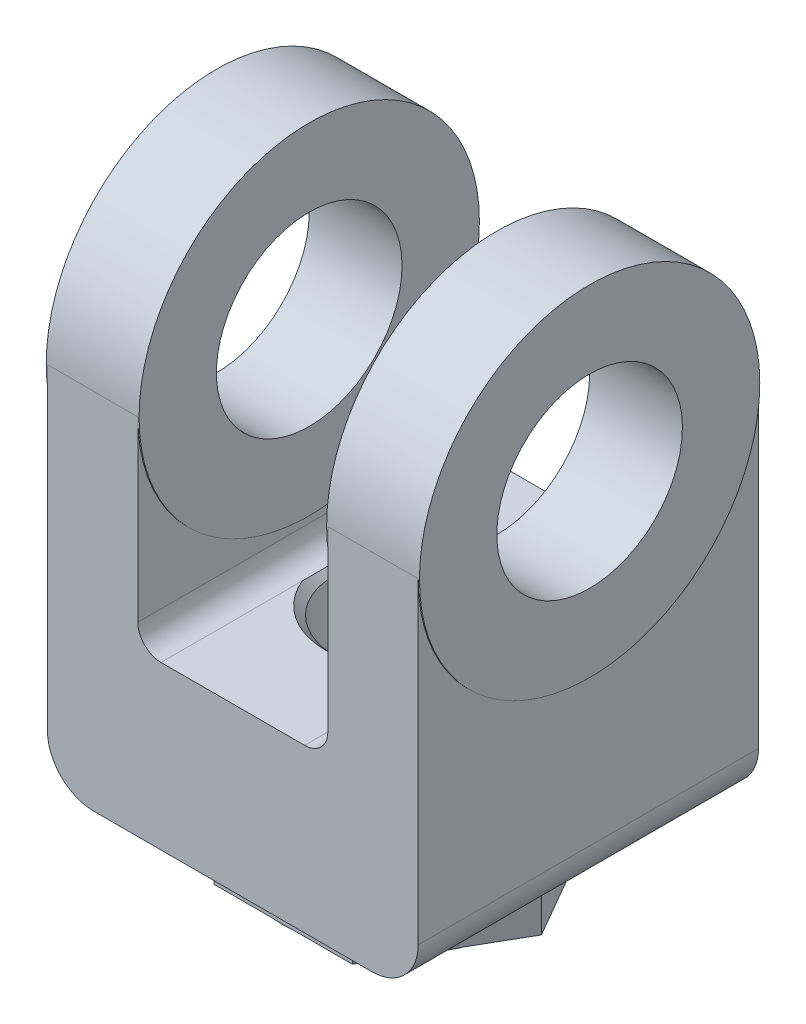
ISO-10303-21;
HEADER;
FILE_DESCRIPTION(('STEP AP214'),'2;1');
FILE_NAME('part.step','',(''),(''),'','','');
FILE_SCHEMA(('AUTOMOTIVE_DESIGN { 1 0 10303 214 1 1 1 1 }'));
ENDSEC;
DATA;
#1=APPLICATION_CONTEXT('core data for automotive mechanical design processes');
#2=APPLICATION_PROTOCOL_DEFINITION('international standard','automotive_design',2000,#1);
#3=PRODUCT_CONTEXT('',#1,'mechanical');
#4=PRODUCT('Part','Part','',(#3));
#5=PRODUCT_RELATED_PRODUCT_CATEGORY('part','',(#4));
#6=PRODUCT_DEFINITION_FORMATION('','',#4);
#7=PRODUCT_DEFINITION_CONTEXT('part definition',#1,'design');
#8=PRODUCT_DEFINITION('design','',#6,#7);
#9=PRODUCT_DEFINITION_SHAPE('','',#8);
#10=(LENGTH_UNIT() NAMED_UNIT(*) SI_UNIT(.MILLI.,.METRE.));
#11=(NAMED_UNIT(*) PLANE_ANGLE_UNIT() SI_UNIT($,.RADIAN.));
#12=(NAMED_UNIT(*) SI_UNIT($,.STERADIAN.) SOLID_ANGLE_UNIT());
#13=UNCERTAINTY_MEASURE_WITH_UNIT(LENGTH_MEASURE(1.E-05),#10,'distance_accuracy_value','');
#14=(GEOMETRIC_REPRESENTATION_CONTEXT(3) GLOBAL_UNCERTAINTY_ASSIGNED_CONTEXT((#13)) GLOBAL_UNIT_ASSIGNED_CONTEXT((#10,
#11,#12)) REPRESENTATION_CONTEXT('',''));
#15=CARTESIAN_POINT('',(0.,0.,0.));
#16=DIRECTION('',(0.,0.,1.));
#17=DIRECTION('',(1.,0.,0.));
#18=AXIS2_PLACEMENT_3D('',#15,#16,#17);
#19=CARTESIAN_POINT('',(28.412850122494,22.225,49.2125));
#20=DIRECTION('',(-0.866025403784435,0.,-0.500000000000007));
#21=DIRECTION('',(-0.500000000000007,0.,0.866025403784435));
#22=AXIS2_PLACEMENT_3D('',#19,#20,#21);
#23=PLANE('',#22);
#24=DIRECTION('',(-0.500000000000014,0.,0.86602540378443));
#25=VECTOR('',#24,1.);
#26=CARTESIAN_POINT('',(42.6192751837415,0.254,24.6062500000003));
#27=LINE('',#26,#25);
#28=CARTESIAN_POINT('',(42.6192751837415,0.254,24.6062500000003));
#29=VERTEX_POINT('',#28);
#30=CARTESIAN_POINT('',(28.4128501224939,0.254,49.2125));
#31=VERTEX_POINT('',#30);
#32=EDGE_CURVE('E262',#29,#31,#27,.T.);
#33=ORIENTED_EDGE('',*,*,#32,.F.);
#34=DIRECTION('',(-0.500000000000001,0.,0.866025403784438));
#35=VECTOR('',#34,1.);
#36=CARTESIAN_POINT('',(56.8257002449889,0.254,0.));
#37=LINE('',#36,#35);
#38=CARTESIAN_POINT('',(56.8257002449889,0.254,0.));
#39=VERTEX_POINT('',#38);
#40=EDGE_CURVE('E254',#39,#29,#37,.T.);
#41=ORIENTED_EDGE('',*,*,#40,.F.);
#42=DIRECTION('',(0.,-1.,0.));
#43=VECTOR('',#42,1.);
#44=CARTESIAN_POINT('',(56.825700244989,22.225,0.));
#45=LINE('',#44,#43);
#46=CARTESIAN_POINT('',(56.8257002449889,22.225,0.));
#47=VERTEX_POINT('',#46);
#48=EDGE_CURVE('E335',#47,#39,#45,.T.);
#49=ORIENTED_EDGE('',*,*,#48,.F.);
#50=DIRECTION('',(0.500000000000007,0.,-0.866025403784434));
#51=VECTOR('',#50,1.);
#52=CARTESIAN_POINT('',(28.412850122494,22.225,49.2125));
#53=LINE('',#52,#51);
#54=CARTESIAN_POINT('',(28.412850122494,22.225,49.2125));
#55=VERTEX_POINT('',#54);
#56=EDGE_CURVE('E326',#55,#47,#53,.T.);
#57=ORIENTED_EDGE('',*,*,#56,.F.);
#58=DIRECTION('',(0.,-1.,0.));
#59=VECTOR('',#58,1.);
#60=CARTESIAN_POINT('',(28.412850122494,22.225,49.2125));
#61=LINE('',#60,#59);
#62=EDGE_CURVE('E2836',#55,#31,#61,.T.);
#63=ORIENTED_EDGE('',*,*,#62,.T.);
#64=EDGE_LOOP('',(#33,#41,#49,#57,#63));
#65=FACE_BOUND('',#64,.T.);
#66=ADVANCED_FACE('F53',(#65),#23,.F.);
#67=CARTESIAN_POINT('',(-28.412850122494,22.225,49.2125));
#68=DIRECTION('',(0.,0.,-1.));
#69=DIRECTION('',(-1.,0.,0.));
#70=AXIS2_PLACEMENT_3D('',#67,#68,#69);
#71=PLANE('',#70);
#72=DIRECTION('',(-1.,0.,0.));
#73=VECTOR('',#72,1.);
#74=CARTESIAN_POINT('',(0.,0.254,49.2125));
#75=LINE('',#74,#73);
#76=CARTESIAN_POINT('',(0.,0.254,49.2125));
#77=VERTEX_POINT('',#76);
#78=CARTESIAN_POINT('',(-28.412850122494,0.254,49.2125));
#79=VERTEX_POINT('',#78);
#80=EDGE_CURVE('E266',#77,#79,#75,.T.);
#81=ORIENTED_EDGE('',*,*,#80,.F.);
#82=DIRECTION('',(-1.,0.,0.));
#83=VECTOR('',#82,1.);
#84=CARTESIAN_POINT('',(28.4128501224939,0.254,49.2125));
#85=LINE('',#84,#83);
#86=EDGE_CURVE('E267',#31,#77,#85,.T.);
#87=ORIENTED_EDGE('',*,*,#86,.F.);
#88=ORIENTED_EDGE('',*,*,#62,.F.);
#89=DIRECTION('',(1.,0.,0.));
#90=VECTOR('',#89,1.);
#91=CARTESIAN_POINT('',(-28.4128501224939,22.225,49.2125));
#92=LINE('',#91,#90);
#93=CARTESIAN_POINT('',(-28.4128501224939,22.225,49.2125));
#94=VERTEX_POINT('',#93);
#95=EDGE_CURVE('E323',#94,#55,#92,.T.);
#96=ORIENTED_EDGE('',*,*,#95,.F.);
#97=DIRECTION('',(0.,-1.,0.));
#98=VECTOR('',#97,1.);
#99=CARTESIAN_POINT('',(-28.4128501224939,22.225,49.2125));
#100=LINE('',#99,#98);
#101=EDGE_CURVE('E2838',#94,#79,#100,.T.);
#102=ORIENTED_EDGE('',*,*,#101,.T.);
#103=EDGE_LOOP('',(#81,#87,#88,#96,#102));
#104=FACE_BOUND('',#103,.T.);
#105=ADVANCED_FACE('F997',(#104),#71,.F.);
#106=CARTESIAN_POINT('',(-56.8257002449889,22.225,0.));
#107=DIRECTION('',(0.866025403784435,0.,-0.500000000000007));
#108=DIRECTION('',(-0.500000000000007,0.,-0.866025403784435));
#109=AXIS2_PLACEMENT_3D('',#106,#107,#108);
#110=PLANE('',#109);
#111=DIRECTION('',(-0.500000000000007,0.,-0.866025403784434));
#112=VECTOR('',#111,1.);
#113=CARTESIAN_POINT('',(-42.6192751837414,0.254,24.6062500000002));
#114=LINE('',#113,#112);
#115=CARTESIAN_POINT('',(-42.6192751837414,0.254,24.6062500000002));
#116=VERTEX_POINT('',#115);
#117=CARTESIAN_POINT('',(-56.825700244989,0.254,0.));
#118=VERTEX_POINT('',#117);
#119=EDGE_CURVE('E271',#116,#118,#114,.T.);
#120=ORIENTED_EDGE('',*,*,#119,.F.);
#121=DIRECTION('',(-0.500000000000013,0.,-0.866025403784431));
#122=VECTOR('',#121,1.);
#123=CARTESIAN_POINT('',(-28.412850122494,0.254,49.2125));
#124=LINE('',#123,#122);
#125=EDGE_CURVE('E272',#79,#116,#124,.T.);
#126=ORIENTED_EDGE('',*,*,#125,.F.);
#127=ORIENTED_EDGE('',*,*,#101,.F.);
#128=DIRECTION('',(0.500000000000007,0.,0.866025403784434));
#129=VECTOR('',#128,1.);
#130=CARTESIAN_POINT('',(-56.8257002449889,22.225,0.));
#131=LINE('',#130,#129);
#132=CARTESIAN_POINT('',(-56.8257002449889,22.225,0.));
#133=VERTEX_POINT('',#132);
#134=EDGE_CURVE('E320',#133,#94,#131,.T.);
#135=ORIENTED_EDGE('',*,*,#134,.F.);
#136=DIRECTION('',(0.,-1.,0.));
#137=VECTOR('',#136,1.);
#138=CARTESIAN_POINT('',(-56.8257002449889,22.225,0.));
#139=LINE('',#138,#137);
#140=EDGE_CURVE('E329',#133,#118,#139,.T.);
#141=ORIENTED_EDGE('',*,*,#140,.T.);
#142=EDGE_LOOP('',(#120,#126,#127,#135,#141));
#143=FACE_BOUND('',#142,.T.);
#144=ADVANCED_FACE('F1007',(#143),#110,.F.);
#145=CARTESIAN_POINT('',(39.0017,171.45,69.85));
#146=DIRECTION('',(1.,0.,0.));
#147=DIRECTION('',(0.,0.,-1.));
#148=AXIS2_PLACEMENT_3D('',#145,#146,#147);
#149=PLANE('',#148);
#150=CARTESIAN_POINT('',(39.0017,171.45,0.));
#151=DIRECTION('',(1.,0.,0.));
#152=DIRECTION('',(0.,0.,-1.));
#153=AXIS2_PLACEMENT_3D('',#150,#151,#152);
#154=CIRCLE('',#153,69.85);
#155=CARTESIAN_POINT('',(39.0017,171.45,-69.85));
#156=VERTEX_POINT('',#155);
#157=CARTESIAN_POINT('',(39.0017,171.45,69.85));
#158=VERTEX_POINT('',#157);
#159=EDGE_CURVE('E237',#156,#158,#154,.F.);
#160=ORIENTED_EDGE('',*,*,#159,.F.);
#161=DIRECTION('',(0.,-1.,0.));
#162=VECTOR('',#161,1.);
#163=CARTESIAN_POINT('',(39.0017,171.45,-69.85));
#164=LINE('',#163,#162);
#165=CARTESIAN_POINT('',(39.0017,98.425,-69.85));
#166=VERTEX_POINT('',#165);
#167=EDGE_CURVE('E226',#156,#166,#164,.T.);
#168=ORIENTED_EDGE('',*,*,#167,.T.);
#169=DIRECTION('',(0.,0.,-1.));
#170=VECTOR('',#169,1.);
#171=CARTESIAN_POINT('',(39.0017,98.425,69.85));
#172=LINE('',#171,#170);
#173=CARTESIAN_POINT('',(39.0017,98.425,69.85));
#174=VERTEX_POINT('',#173);
#175=EDGE_CURVE('E229',#174,#166,#172,.T.);
#176=ORIENTED_EDGE('',*,*,#175,.F.);
#177=DIRECTION('',(0.,-1.,0.));
#178=VECTOR('',#177,1.);
#179=CARTESIAN_POINT('',(39.0017,171.45,69.85));
#180=LINE('',#179,#178);
#181=EDGE_CURVE('E1540',#158,#174,#180,.T.);
#182=ORIENTED_EDGE('',*,*,#181,.F.);
#183=EDGE_LOOP('',(#160,#168,#176,#182));
#184=FACE_BOUND('',#183,.T.);
#185=ADVANCED_FACE('F1038',(#184),#149,.F.);
#186=CARTESIAN_POINT('',(-39.0017,98.425,69.85));
#187=DIRECTION('',(-1.,0.,0.));
#188=DIRECTION('',(0.,0.,1.));
#189=AXIS2_PLACEMENT_3D('',#186,#187,#188);
#190=PLANE('',#189);
#191=CARTESIAN_POINT('',(-39.0017,171.45,0.));
#192=DIRECTION('',(-1.,0.,0.));
#193=DIRECTION('',(0.,0.,1.));
#194=AXIS2_PLACEMENT_3D('',#191,#192,#193);
#195=CIRCLE('',#194,69.85);
#196=CARTESIAN_POINT('',(-39.0017,171.45,69.85));
#197=VERTEX_POINT('',#196);
#198=CARTESIAN_POINT('',(-39.0017,171.45,-69.85));
#199=VERTEX_POINT('',#198);
#200=EDGE_CURVE('E242',#197,#199,#195,.F.);
#201=ORIENTED_EDGE('',*,*,#200,.F.);
#202=DIRECTION('',(0.,1.,0.));
#203=VECTOR('',#202,1.);
#204=CARTESIAN_POINT('',(-39.0017,98.425,69.85));
#205=LINE('',#204,#203);
#206=CARTESIAN_POINT('',(-39.0017,98.4249999999995,69.85));
#207=VERTEX_POINT('',#206);
#208=EDGE_CURVE('E879',#207,#197,#205,.T.);
#209=ORIENTED_EDGE('',*,*,#208,.F.);
#210=DIRECTION('',(0.,0.,-1.));
#211=VECTOR('',#210,1.);
#212=CARTESIAN_POINT('',(-39.0017,98.4249999999995,69.85));
#213=LINE('',#212,#211);
#214=CARTESIAN_POINT('',(-39.0017,98.4249999999995,-69.85));
#215=VERTEX_POINT('',#214);
#216=EDGE_CURVE('E769',#207,#215,#213,.T.);
#217=ORIENTED_EDGE('',*,*,#216,.T.);
#218=DIRECTION('',(0.,1.,0.));
#219=VECTOR('',#218,1.);
#220=CARTESIAN_POINT('',(-39.0017,98.425,-69.85));
#221=LINE('',#220,#219);
#222=EDGE_CURVE('E767',#215,#199,#221,.T.);
#223=ORIENTED_EDGE('',*,*,#222,.T.);
#224=EDGE_LOOP('',(#201,#209,#217,#223));
#225=FACE_BOUND('',#224,.T.);
#226=ADVANCED_FACE('F1035',(#225),#190,.F.);
#227=CARTESIAN_POINT('',(-57.035700000001,41.274999999999,-69.85));
#228=DIRECTION('',(0.,0.,1.));
#229=DIRECTION('',(1.,0.,0.));
#230=AXIS2_PLACEMENT_3D('',#227,#228,#229);
#231=PLANE('',#230);
#232=DIRECTION('',(0.,1.,0.));
#233=VECTOR('',#232,1.);
#234=CARTESIAN_POINT('',(76.0857,171.45,-69.85));
#235=LINE('',#234,#233);
#236=CARTESIAN_POINT('',(76.0857,41.2749999999991,-69.85));
#237=VERTEX_POINT('',#236);
#238=CARTESIAN_POINT('',(76.0857,171.45,-69.85));
#239=VERTEX_POINT('',#238);
#240=EDGE_CURVE('E208',#237,#239,#235,.T.);
#241=ORIENTED_EDGE('',*,*,#240,.F.);
#242=CARTESIAN_POINT('',(57.0357000000009,41.2749999999991,-69.85));
#243=DIRECTION('',(0.,0.,1.));
#244=DIRECTION('',(1.,0.,0.));
#245=AXIS2_PLACEMENT_3D('',#242,#243,#244);
#246=CIRCLE('',#245,19.0499999999991);
#247=CARTESIAN_POINT('',(57.0357000000009,22.225,-69.85));
#248=VERTEX_POINT('',#247);
#249=EDGE_CURVE('E2770',#237,#248,#246,.F.);
#250=ORIENTED_EDGE('',*,*,#249,.T.);
#251=DIRECTION('',(1.,0.,0.));
#252=VECTOR('',#251,1.);
#253=CARTESIAN_POINT('',(-56.8257002449889,22.225,-69.85));
#254=LINE('',#253,#252);
#255=CARTESIAN_POINT('',(-57.0357000000009,22.225,-69.85));
#256=VERTEX_POINT('',#255);
#257=EDGE_CURVE('E299',#256,#248,#254,.T.);
#258=ORIENTED_EDGE('',*,*,#257,.F.);
#259=CARTESIAN_POINT('',(-57.0357000000009,41.2749999999991,-69.85));
#260=DIRECTION('',(0.,0.,1.));
#261=DIRECTION('',(1.,0.,0.));
#262=AXIS2_PLACEMENT_3D('',#259,#260,#261);
#263=CIRCLE('',#262,19.0499999999991);
#264=CARTESIAN_POINT('',(-76.0857,41.2749999999991,-69.85));
#265=VERTEX_POINT('',#264);
#266=EDGE_CURVE('E2771',#256,#265,#263,.F.);
#267=ORIENTED_EDGE('',*,*,#266,.T.);
#268=DIRECTION('',(0.,-1.,0.));
#269=VECTOR('',#268,1.);
#270=CARTESIAN_POINT('',(-76.0857,22.225,-69.85));
#271=LINE('',#270,#269);
#272=CARTESIAN_POINT('',(-76.0857,171.45,-69.85));
#273=VERTEX_POINT('',#272);
#274=EDGE_CURVE('E218',#273,#265,#271,.T.);
#275=ORIENTED_EDGE('',*,*,#274,.F.);
#276=DIRECTION('',(-1.,0.,0.));
#277=VECTOR('',#276,1.);
#278=CARTESIAN_POINT('',(-39.0017,171.45,-69.85));
#279=LINE('',#278,#277);
#280=EDGE_CURVE('E725',#199,#273,#279,.T.);
#281=ORIENTED_EDGE('',*,*,#280,.F.);
#282=ORIENTED_EDGE('',*,*,#222,.F.);
#283=CARTESIAN_POINT('',(-29.4767000000005,98.4249999999995,-69.85));
#284=DIRECTION('',(0.,0.,1.));
#285=DIRECTION('',(1.,0.,0.));
#286=AXIS2_PLACEMENT_3D('',#283,#284,#285);
#287=CIRCLE('',#286,9.52499999999952);
#288=CARTESIAN_POINT('',(-29.4767,88.9,-69.85));
#289=VERTEX_POINT('',#288);
#290=EDGE_CURVE('E801',#215,#289,#287,.T.);
#291=ORIENTED_EDGE('',*,*,#290,.T.);
#292=DIRECTION('',(-1.,0.,0.));
#293=VECTOR('',#292,1.);
#294=CARTESIAN_POINT('',(29.4767,88.9,-69.85));
#295=LINE('',#294,#293);
#296=CARTESIAN_POINT('',(29.4767000000005,88.9,-69.85));
#297=VERTEX_POINT('',#296);
#298=EDGE_CURVE('E958',#297,#289,#295,.T.);
#299=ORIENTED_EDGE('',*,*,#298,.F.);
#300=CARTESIAN_POINT('',(29.4767000000005,98.4249999999995,-69.85));
#301=DIRECTION('',(0.,0.,1.));
#302=DIRECTION('',(1.,0.,0.));
#303=AXIS2_PLACEMENT_3D('',#300,#301,#302);
#304=CIRCLE('',#303,9.52499999999952);
#305=EDGE_CURVE('E935',#297,#166,#304,.T.);
#306=ORIENTED_EDGE('',*,*,#305,.T.);
#307=ORIENTED_EDGE('',*,*,#167,.F.);
#308=DIRECTION('',(-1.,0.,0.));
#309=VECTOR('',#308,1.);
#310=CARTESIAN_POINT('',(76.0857,171.45,-69.85));
#311=LINE('',#310,#309);
#312=EDGE_CURVE('E223',#239,#156,#311,.T.);
#313=ORIENTED_EDGE('',*,*,#312,.F.);
#314=EDGE_LOOP('',(#241,#250,#258,#267,#275,#281,#282,#291,#299,#306,#307,#313));
#315=FACE_BOUND('',#314,.T.);
#316=ADVANCED_FACE('F224',(#315),#231,.F.);
#317=CARTESIAN_POINT('',(-57.035700000001,41.274999999999,69.85));
#318=DIRECTION('',(0.,0.,1.));
#319=DIRECTION('',(1.,0.,0.));
#320=AXIS2_PLACEMENT_3D('',#317,#318,#319);
#321=PLANE('',#320);
#322=DIRECTION('',(-1.,0.,0.));
#323=VECTOR('',#322,1.);
#324=CARTESIAN_POINT('',(56.8257002449889,22.225,69.85));
#325=LINE('',#324,#323);
#326=CARTESIAN_POINT('',(57.0357000000009,22.225,69.85));
#327=VERTEX_POINT('',#326);
#328=CARTESIAN_POINT('',(-57.0357000000009,22.225,69.85));
#329=VERTEX_POINT('',#328);
#330=EDGE_CURVE('E318',#327,#329,#325,.T.);
#331=ORIENTED_EDGE('',*,*,#330,.F.);
#332=CARTESIAN_POINT('',(57.0357000000009,41.2749999999991,69.85));
#333=DIRECTION('',(0.,0.,1.));
#334=DIRECTION('',(1.,0.,0.));
#335=AXIS2_PLACEMENT_3D('',#332,#333,#334);
#336=CIRCLE('',#335,19.0499999999991);
#337=CARTESIAN_POINT('',(76.0857,41.2749999999991,69.85));
#338=VERTEX_POINT('',#337);
#339=EDGE_CURVE('E61',#327,#338,#336,.T.);
#340=ORIENTED_EDGE('',*,*,#339,.T.);
#341=DIRECTION('',(0.,-1.,0.));
#342=VECTOR('',#341,1.);
#343=CARTESIAN_POINT('',(76.0857,22.225,69.85));
#344=LINE('',#343,#342);
#345=CARTESIAN_POINT('',(76.0857,171.45,69.85));
#346=VERTEX_POINT('',#345);
#347=EDGE_CURVE('E219',#346,#338,#344,.T.);
#348=ORIENTED_EDGE('',*,*,#347,.F.);
#349=DIRECTION('',(-1.,0.,0.));
#350=VECTOR('',#349,1.);
#351=CARTESIAN_POINT('',(76.0857,171.45,69.85));
#352=LINE('',#351,#350);
#353=EDGE_CURVE('E234',#346,#158,#352,.T.);
#354=ORIENTED_EDGE('',*,*,#353,.T.);
#355=ORIENTED_EDGE('',*,*,#181,.T.);
#356=CARTESIAN_POINT('',(29.4767000000005,98.4249999999995,69.85));
#357=DIRECTION('',(0.,0.,1.));
#358=DIRECTION('',(1.,0.,0.));
#359=AXIS2_PLACEMENT_3D('',#356,#357,#358);
#360=CIRCLE('',#359,9.52499999999952);
#361=CARTESIAN_POINT('',(29.4767000000005,88.9,69.85));
#362=VERTEX_POINT('',#361);
#363=EDGE_CURVE('E914',#362,#174,#360,.T.);
#364=ORIENTED_EDGE('',*,*,#363,.F.);
#365=DIRECTION('',(-1.,0.,0.));
#366=VECTOR('',#365,1.);
#367=CARTESIAN_POINT('',(29.4767,88.9,69.85));
#368=LINE('',#367,#366);
#369=CARTESIAN_POINT('',(-29.4767,88.9,69.85));
#370=VERTEX_POINT('',#369);
#371=EDGE_CURVE('E856',#362,#370,#368,.T.);
#372=ORIENTED_EDGE('',*,*,#371,.T.);
#373=CARTESIAN_POINT('',(-29.4767000000005,98.4249999999995,69.85));
#374=DIRECTION('',(0.,0.,1.));
#375=DIRECTION('',(1.,0.,0.));
#376=AXIS2_PLACEMENT_3D('',#373,#374,#375);
#377=CIRCLE('',#376,9.52499999999952);
#378=EDGE_CURVE('E854',#207,#370,#377,.T.);
#379=ORIENTED_EDGE('',*,*,#378,.F.);
#380=ORIENTED_EDGE('',*,*,#208,.T.);
#381=DIRECTION('',(-1.,0.,0.));
#382=VECTOR('',#381,1.);
#383=CARTESIAN_POINT('',(-39.0017,171.45,69.85));
#384=LINE('',#383,#382);
#385=CARTESIAN_POINT('',(-76.0857,171.45,69.85));
#386=VERTEX_POINT('',#385);
#387=EDGE_CURVE('E727',#197,#386,#384,.T.);
#388=ORIENTED_EDGE('',*,*,#387,.T.);
#389=DIRECTION('',(0.,1.,0.));
#390=VECTOR('',#389,1.);
#391=CARTESIAN_POINT('',(-76.0857,171.45,69.85));
#392=LINE('',#391,#390);
#393=CARTESIAN_POINT('',(-76.0857,41.2749999999991,69.85));
#394=VERTEX_POINT('',#393);
#395=EDGE_CURVE('E290',#394,#386,#392,.T.);
#396=ORIENTED_EDGE('',*,*,#395,.F.);
#397=CARTESIAN_POINT('',(-57.0357000000009,41.2749999999991,69.85));
#398=DIRECTION('',(0.,0.,1.));
#399=DIRECTION('',(1.,0.,0.));
#400=AXIS2_PLACEMENT_3D('',#397,#398,#399);
#401=CIRCLE('',#400,19.0499999999991);
#402=EDGE_CURVE('E68',#394,#329,#401,.T.);
#403=ORIENTED_EDGE('',*,*,#402,.T.);
#404=EDGE_LOOP('',(#331,#340,#348,#354,#355,#364,#372,#379,#380,#388,#396,#403));
#405=FACE_BOUND('',#404,.T.);
#406=ADVANCED_FACE('F1028',(#405),#321,.T.);
#407=CARTESIAN_POINT('',(-38.4937,171.45,0.));
#408=DIRECTION('',(-1.,0.,0.));
#409=DIRECTION('',(0.,-1.,0.));
#410=AXIS2_PLACEMENT_3D('',#407,#408,#409);
#411=CYLINDRICAL_SURFACE('',#410,69.85);
#412=ORIENTED_EDGE('',*,*,#280,.T.);
#413=CARTESIAN_POINT('',(-76.0857,171.45,0.));
#414=DIRECTION('',(-1.,0.,0.));
#415=DIRECTION('',(0.,0.,1.));
#416=AXIS2_PLACEMENT_3D('',#413,#414,#415);
#417=CIRCLE('',#416,69.85);
#418=EDGE_CURVE('E283',#273,#386,#417,.T.);
#419=ORIENTED_EDGE('',*,*,#418,.T.);
#420=ORIENTED_EDGE('',*,*,#387,.F.);
#421=ORIENTED_EDGE('',*,*,#200,.T.);
#422=EDGE_LOOP('',(#412,#419,#420,#421));
#423=FACE_BOUND('',#422,.T.);
#424=CARTESIAN_POINT('',(-76.5937,171.45,0.));
#425=DIRECTION('',(-1.,0.,0.));
#426=DIRECTION('',(0.,0.,1.));
#427=AXIS2_PLACEMENT_3D('',#424,#425,#426);
#428=CIRCLE('',#427,69.85);
#429=CARTESIAN_POINT('',(-76.5937,171.45,69.85));
#430=VERTEX_POINT('',#429);
#431=EDGE_CURVE('E280',#430,#430,#428,.T.);
#432=ORIENTED_EDGE('',*,*,#431,.F.);
#433=EDGE_LOOP('',(#432));
#434=FACE_BOUND('',#433,.T.);
#435=CARTESIAN_POINT('',(-38.4937,171.45,0.));
#436=DIRECTION('',(1.,0.,0.));
#437=DIRECTION('',(0.,0.,-1.));
#438=AXIS2_PLACEMENT_3D('',#435,#436,#437);
#439=CIRCLE('',#438,69.85);
#440=CARTESIAN_POINT('',(-38.4937,171.45,-69.85));
#441=VERTEX_POINT('',#440);
#442=EDGE_CURVE('E276',#441,#441,#439,.T.);
#443=ORIENTED_EDGE('',*,*,#442,.F.);
#444=EDGE_LOOP('',(#443));
#445=FACE_BOUND('',#444,.T.);
#446=ADVANCED_FACE('F1031',(#423,#434,#445),#411,.T.);
#447=CARTESIAN_POINT('',(76.5937,171.45,0.));
#448=DIRECTION('',(-1.,0.,0.));
#449=DIRECTION('',(0.,1.,0.));
#450=AXIS2_PLACEMENT_3D('',#447,#448,#449);
#451=CYLINDRICAL_SURFACE('',#450,69.85);
#452=ORIENTED_EDGE('',*,*,#353,.F.);
#453=CARTESIAN_POINT('',(76.0857,171.45,0.));
#454=DIRECTION('',(1.,0.,0.));
#455=DIRECTION('',(0.,0.,-1.));
#456=AXIS2_PLACEMENT_3D('',#453,#454,#455);
#457=CIRCLE('',#456,69.85);
#458=EDGE_CURVE('E213',#346,#239,#457,.T.);
#459=ORIENTED_EDGE('',*,*,#458,.T.);
#460=ORIENTED_EDGE('',*,*,#312,.T.);
#461=ORIENTED_EDGE('',*,*,#159,.T.);
#462=EDGE_LOOP('',(#452,#459,#460,#461));
#463=FACE_BOUND('',#462,.T.);
#464=CARTESIAN_POINT('',(38.4937,171.45,0.));
#465=DIRECTION('',(-1.,0.,0.));
#466=DIRECTION('',(0.,0.,1.));
#467=AXIS2_PLACEMENT_3D('',#464,#465,#466);
#468=CIRCLE('',#467,69.85);
#469=CARTESIAN_POINT('',(38.4937,171.45,69.85));
#470=VERTEX_POINT('',#469);
#471=EDGE_CURVE('E273',#470,#470,#468,.T.);
#472=ORIENTED_EDGE('',*,*,#471,.F.);
#473=EDGE_LOOP('',(#472));
#474=FACE_BOUND('',#473,.T.);
#475=CARTESIAN_POINT('',(76.5937,171.45,0.));
#476=DIRECTION('',(1.,0.,0.));
#477=DIRECTION('',(0.,0.,-1.));
#478=AXIS2_PLACEMENT_3D('',#475,#476,#477);
#479=CIRCLE('',#478,69.85);
#480=CARTESIAN_POINT('',(76.5937,171.45,-69.85));
#481=VERTEX_POINT('',#480);
#482=EDGE_CURVE('E246',#481,#481,#479,.T.);
#483=ORIENTED_EDGE('',*,*,#482,.F.);
#484=EDGE_LOOP('',(#483));
#485=FACE_BOUND('',#484,.T.);
#486=ADVANCED_FACE('F231',(#463,#474,#485),#451,.T.);
#487=CARTESIAN_POINT('',(29.4767000000005,98.4249999999995,69.85));
#488=DIRECTION('',(0.,0.,1.));
#489=DIRECTION('',(-0.707106781186567,0.707106781186528,0.));
#490=AXIS2_PLACEMENT_3D('',#487,#488,#489);
#491=CYLINDRICAL_SURFACE('',#490,9.52499999999952);
#492=ORIENTED_EDGE('',*,*,#175,.T.);
#493=ORIENTED_EDGE('',*,*,#305,.F.);
#494=DIRECTION('',(0.,0.,-1.));
#495=VECTOR('',#494,1.);
#496=CARTESIAN_POINT('',(29.4767000000005,88.9,69.85));
#497=LINE('',#496,#495);
#498=CARTESIAN_POINT('',(29.4767000000005,88.9,-11.7977394915285));
#499=VERTEX_POINT('',#498);
#500=EDGE_CURVE('E1653',#499,#297,#497,.T.);
#501=ORIENTED_EDGE('',*,*,#500,.F.);
#502=DIRECTION('',(0.,0.,-1.));
#503=VECTOR('',#502,1.);
#504=CARTESIAN_POINT('',(29.4767000000005,88.9,69.85));
#505=LINE('',#504,#503);
#506=CARTESIAN_POINT('',(29.4767000000005,88.9,11.7977394915285));
#507=VERTEX_POINT('',#506);
#508=EDGE_CURVE('E1663',#507,#499,#505,.T.);
#509=ORIENTED_EDGE('',*,*,#508,.F.);
#510=DIRECTION('',(0.,0.,-1.));
#511=VECTOR('',#510,1.);
#512=CARTESIAN_POINT('',(29.4767000000005,88.9,69.85));
#513=LINE('',#512,#511);
#514=EDGE_CURVE('E1673',#362,#507,#513,.T.);
#515=ORIENTED_EDGE('',*,*,#514,.F.);
#516=ORIENTED_EDGE('',*,*,#363,.T.);
#517=EDGE_LOOP('',(#492,#493,#501,#509,#515,#516));
#518=FACE_BOUND('',#517,.T.);
#519=ADVANCED_FACE('F1044',(#518),#491,.F.);
#520=CARTESIAN_POINT('',(29.4767,88.9,69.85));
#521=DIRECTION('',(0.,-1.,0.));
#522=DIRECTION('',(0.,0.,-1.));
#523=AXIS2_PLACEMENT_3D('',#520,#521,#522);
#524=PLANE('',#523);
#525=CARTESIAN_POINT('',(0.,88.9,0.));
#526=DIRECTION('',(0.,-1.,0.));
#527=DIRECTION('',(0.,0.,-1.));
#528=AXIS2_PLACEMENT_3D('',#525,#526,#527);
#529=CIRCLE('',#528,31.75);
#530=CARTESIAN_POINT('',(-29.4767000000005,88.9,11.7977394915285));
#531=VERTEX_POINT('',#530);
#532=EDGE_CURVE('E1683',#507,#531,#529,.T.);
#533=ORIENTED_EDGE('',*,*,#532,.T.);
#534=DIRECTION('',(0.,0.,-1.));
#535=VECTOR('',#534,1.);
#536=CARTESIAN_POINT('',(-29.4767,88.9,69.85));
#537=LINE('',#536,#535);
#538=EDGE_CURVE('E1692',#370,#531,#537,.T.);
#539=ORIENTED_EDGE('',*,*,#538,.F.);
#540=ORIENTED_EDGE('',*,*,#371,.F.);
#541=ORIENTED_EDGE('',*,*,#514,.T.);
#542=EDGE_LOOP('',(#533,#539,#540,#541));
#543=FACE_BOUND('',#542,.T.);
#544=ADVANCED_FACE('F1050',(#543),#524,.F.);
#545=CARTESIAN_POINT('',(-29.4767000000005,98.4249999999995,69.85));
#546=DIRECTION('',(0.,0.,1.));
#547=DIRECTION('',(0.707106781186529,0.707106781186566,0.));
#548=AXIS2_PLACEMENT_3D('',#545,#546,#547);
#549=CYLINDRICAL_SURFACE('',#548,9.52499999999952);
#550=DIRECTION('',(0.,0.,-1.));
#551=VECTOR('',#550,1.);
#552=CARTESIAN_POINT('',(-29.4767,88.9,69.85));
#553=LINE('',#552,#551);
#554=CARTESIAN_POINT('',(-29.4767,88.9,-11.7977394915297));
#555=VERTEX_POINT('',#554);
#556=EDGE_CURVE('E1702',#555,#289,#553,.T.);
#557=ORIENTED_EDGE('',*,*,#556,.T.);
#558=ORIENTED_EDGE('',*,*,#290,.F.);
#559=ORIENTED_EDGE('',*,*,#216,.F.);
#560=ORIENTED_EDGE('',*,*,#378,.T.);
#561=ORIENTED_EDGE('',*,*,#538,.T.);
#562=DIRECTION('',(0.,0.,-1.));
#563=VECTOR('',#562,1.);
#564=CARTESIAN_POINT('',(-29.4767,88.9,69.85));
#565=LINE('',#564,#563);
#566=EDGE_CURVE('E1712',#531,#555,#565,.T.);
#567=ORIENTED_EDGE('',*,*,#566,.T.);
#568=EDGE_LOOP('',(#557,#558,#559,#560,#561,#567));
#569=FACE_BOUND('',#568,.T.);
#570=ADVANCED_FACE('F1054',(#569),#549,.F.);
#571=CARTESIAN_POINT('',(0.,88.9,0.));
#572=DIRECTION('',(0.,-1.,0.));
#573=DIRECTION('',(0.,0.,-1.));
#574=AXIS2_PLACEMENT_3D('',#571,#572,#573);
#575=PLANE('',#574);
#576=CARTESIAN_POINT('',(0.,88.9,0.));
#577=DIRECTION('',(0.,-1.,0.));
#578=DIRECTION('',(0.,0.,-1.));
#579=AXIS2_PLACEMENT_3D('',#576,#577,#578);
#580=CIRCLE('',#579,31.75);
#581=EDGE_CURVE('E1721',#531,#555,#580,.T.);
#582=ORIENTED_EDGE('',*,*,#581,.T.);
#583=ORIENTED_EDGE('',*,*,#566,.F.);
#584=EDGE_LOOP('',(#582,#583));
#585=FACE_BOUND('',#584,.T.);
#586=ADVANCED_FACE('F1058',(#585),#575,.T.);
#587=CARTESIAN_POINT('',(0.,88.9,0.));
#588=DIRECTION('',(0.,1.,0.));
#589=DIRECTION('',(0.371582346189875,0.,0.928400000000015));
#590=AXIS2_PLACEMENT_3D('',#587,#588,#589);
#591=CONICAL_SURFACE('',#590,31.75,0.785398163397448);
#592=ORIENTED_EDGE('',*,*,#581,.F.);
#593=ORIENTED_EDGE('',*,*,#532,.F.);
#594=CARTESIAN_POINT('',(0.,88.9,0.));
#595=DIRECTION('',(0.,-1.,0.));
#596=DIRECTION('',(0.,0.,-1.));
#597=AXIS2_PLACEMENT_3D('',#594,#595,#596);
#598=CIRCLE('',#597,31.75);
#599=EDGE_CURVE('E330',#499,#507,#598,.T.);
#600=ORIENTED_EDGE('',*,*,#599,.F.);
#601=CARTESIAN_POINT('',(0.,88.9,0.));
#602=DIRECTION('',(0.,-1.,0.));
#603=DIRECTION('',(0.,0.,-1.));
#604=AXIS2_PLACEMENT_3D('',#601,#602,#603);
#605=CIRCLE('',#604,31.75);
#606=EDGE_CURVE('E334',#555,#499,#605,.T.);
#607=ORIENTED_EDGE('',*,*,#606,.F.);
#608=EDGE_LOOP('',(#592,#593,#600,#607));
#609=FACE_BOUND('',#608,.T.);
#610=CARTESIAN_POINT('',(0.,85.46338,0.));
#611=DIRECTION('',(0.,-1.,0.));
#612=DIRECTION('',(0.,0.,-1.));
#613=AXIS2_PLACEMENT_3D('',#610,#611,#612);
#614=CIRCLE('',#613,28.31338);
#615=CARTESIAN_POINT('',(0.,85.46338,-28.31338));
#616=VERTEX_POINT('',#615);
#617=EDGE_CURVE('E378',#616,#616,#614,.T.);
#618=ORIENTED_EDGE('',*,*,#617,.T.);
#619=EDGE_LOOP('',(#618));
#620=FACE_BOUND('',#619,.T.);
#621=ADVANCED_FACE('F1062',(#609,#620),#591,.F.);
#622=CARTESIAN_POINT('',(0.,0.,0.));
#623=DIRECTION('',(0.,1.,0.));
#624=DIRECTION('',(1.,0.,0.));
#625=AXIS2_PLACEMENT_3D('',#622,#623,#624);
#626=CYLINDRICAL_SURFACE('',#625,28.31338);
#627=CARTESIAN_POINT('',(0.,3.43661999999997,0.));
#628=DIRECTION('',(0.,1.,0.));
#629=DIRECTION('',(0.,0.,1.));
#630=AXIS2_PLACEMENT_3D('',#627,#628,#629);
#631=CIRCLE('',#630,28.31338);
#632=CARTESIAN_POINT('',(0.,3.43661999999997,28.31338));
#633=VERTEX_POINT('',#632);
#634=EDGE_CURVE('E240',#633,#633,#631,.F.);
#635=ORIENTED_EDGE('',*,*,#634,.T.);
#636=EDGE_LOOP('',(#635));
#637=FACE_BOUND('',#636,.T.);
#638=ORIENTED_EDGE('',*,*,#617,.F.);
#639=EDGE_LOOP('',(#638));
#640=FACE_BOUND('',#639,.T.);
#641=ADVANCED_FACE('F1066',(#637,#640),#626,.F.);
#642=CARTESIAN_POINT('',(0.,88.9,0.));
#643=DIRECTION('',(0.,-1.,0.));
#644=DIRECTION('',(0.,0.,-1.));
#645=AXIS2_PLACEMENT_3D('',#642,#643,#644);
#646=PLANE('',#645);
#647=ORIENTED_EDGE('',*,*,#508,.T.);
#648=ORIENTED_EDGE('',*,*,#599,.T.);
#649=EDGE_LOOP('',(#647,#648));
#650=FACE_BOUND('',#649,.T.);
#651=ADVANCED_FACE('F1070',(#650),#646,.T.);
#652=CARTESIAN_POINT('',(49.2125,0.,0.));
#653=DIRECTION('',(0.,1.,0.));
#654=DIRECTION('',(0.,0.,1.));
#655=AXIS2_PLACEMENT_3D('',#652,#653,#654);
#656=PLANE('',#655);
#657=CARTESIAN_POINT('',(0.,0.,0.));
#658=DIRECTION('',(0.,1.,0.));
#659=DIRECTION('',(0.,0.,1.));
#660=AXIS2_PLACEMENT_3D('',#657,#658,#659);
#661=CIRCLE('',#660,31.75);
#662=CARTESIAN_POINT('',(0.,0.,31.75));
#663=VERTEX_POINT('',#662);
#664=EDGE_CURVE('E236',#663,#663,#661,.T.);
#665=ORIENTED_EDGE('',*,*,#664,.T.);
#666=EDGE_LOOP('',(#665));
#667=FACE_BOUND('',#666,.T.);
#668=CARTESIAN_POINT('',(0.,0.,0.));
#669=DIRECTION('',(0.,1.,0.));
#670=DIRECTION('',(0.,0.,1.));
#671=AXIS2_PLACEMENT_3D('',#668,#669,#670);
#672=CIRCLE('',#671,49.2125);
#673=CARTESIAN_POINT('',(0.,0.,49.2125));
#674=VERTEX_POINT('',#673);
#675=EDGE_CURVE('E309',#674,#674,#672,.T.);
#676=ORIENTED_EDGE('',*,*,#675,.F.);
#677=EDGE_LOOP('',(#676));
#678=FACE_BOUND('',#677,.T.);
#679=ADVANCED_FACE('F1074',(#667,#678),#656,.F.);
#680=CARTESIAN_POINT('',(29.4767,88.9,69.85));
#681=DIRECTION('',(0.,-1.,0.));
#682=DIRECTION('',(0.,0.,-1.));
#683=AXIS2_PLACEMENT_3D('',#680,#681,#682);
#684=PLANE('',#683);
#685=ORIENTED_EDGE('',*,*,#606,.T.);
#686=ORIENTED_EDGE('',*,*,#500,.T.);
#687=ORIENTED_EDGE('',*,*,#298,.T.);
#688=ORIENTED_EDGE('',*,*,#556,.F.);
#689=EDGE_LOOP('',(#685,#686,#687,#688));
#690=FACE_BOUND('',#689,.T.);
#691=ADVANCED_FACE('F1078',(#690),#684,.F.);
#692=CARTESIAN_POINT('',(0.,22.225,0.));
#693=DIRECTION('',(0.,-1.,0.));
#694=DIRECTION('',(0.,0.,-1.));
#695=AXIS2_PLACEMENT_3D('',#692,#693,#694);
#696=PLANE('',#695);
#697=ORIENTED_EDGE('',*,*,#257,.T.);
#698=DIRECTION('',(0.,0.,-1.));
#699=VECTOR('',#698,1.);
#700=CARTESIAN_POINT('',(57.0357000000009,22.225,69.85));
#701=LINE('',#700,#699);
#702=EDGE_CURVE('E2780',#248,#327,#701,.F.);
#703=ORIENTED_EDGE('',*,*,#702,.T.);
#704=ORIENTED_EDGE('',*,*,#330,.T.);
#705=DIRECTION('',(0.,0.,1.));
#706=VECTOR('',#705,1.);
#707=CARTESIAN_POINT('',(-57.0357000000009,22.225,-69.85));
#708=LINE('',#707,#706);
#709=EDGE_CURVE('E2778',#329,#256,#708,.F.);
#710=ORIENTED_EDGE('',*,*,#709,.T.);
#711=EDGE_LOOP('',(#697,#703,#704,#710));
#712=FACE_BOUND('',#711,.T.);
#713=ORIENTED_EDGE('',*,*,#56,.T.);
#714=DIRECTION('',(-0.500000000000007,0.,-0.866025403784434));
#715=VECTOR('',#714,1.);
#716=CARTESIAN_POINT('',(56.8257002449889,22.225,0.));
#717=LINE('',#716,#715);
#718=CARTESIAN_POINT('',(28.4128501224939,22.225,-49.2125));
#719=VERTEX_POINT('',#718);
#720=EDGE_CURVE('E302',#47,#719,#717,.T.);
#721=ORIENTED_EDGE('',*,*,#720,.T.);
#722=DIRECTION('',(-1.,0.,0.));
#723=VECTOR('',#722,1.);
#724=CARTESIAN_POINT('',(28.4128501224939,22.225,-49.2125));
#725=LINE('',#724,#723);
#726=CARTESIAN_POINT('',(-28.412850122494,22.225,-49.2125));
#727=VERTEX_POINT('',#726);
#728=EDGE_CURVE('E293',#719,#727,#725,.T.);
#729=ORIENTED_EDGE('',*,*,#728,.T.);
#730=DIRECTION('',(-0.500000000000007,0.,0.866025403784434));
#731=VECTOR('',#730,1.);
#732=CARTESIAN_POINT('',(-28.412850122494,22.225,-49.2125));
#733=LINE('',#732,#731);
#734=EDGE_CURVE('E296',#727,#133,#733,.T.);
#735=ORIENTED_EDGE('',*,*,#734,.T.);
#736=ORIENTED_EDGE('',*,*,#134,.T.);
#737=ORIENTED_EDGE('',*,*,#95,.T.);
#738=EDGE_LOOP('',(#713,#721,#729,#735,#736,#737));
#739=FACE_BOUND('',#738,.T.);
#740=ADVANCED_FACE('F1082',(#712,#739),#696,.T.);
#741=CARTESIAN_POINT('',(0.,0.254,0.));
#742=DIRECTION('',(0.,-1.,0.));
#743=DIRECTION('',(0.,0.,-1.));
#744=AXIS2_PLACEMENT_3D('',#741,#742,#743);
#745=CYLINDRICAL_SURFACE('',#744,49.2125);
#746=ORIENTED_EDGE('',*,*,#675,.T.);
#747=EDGE_LOOP('',(#746));
#748=FACE_BOUND('',#747,.T.);
#749=CARTESIAN_POINT('',(0.,0.254,0.));
#750=DIRECTION('',(0.,1.,0.));
#751=DIRECTION('',(0.,0.,1.));
#752=AXIS2_PLACEMENT_3D('',#749,#750,#751);
#753=CIRCLE('',#752,49.2125);
#754=CARTESIAN_POINT('',(42.6192751837415,0.253999999999997,-24.6062500000003));
#755=VERTEX_POINT('',#754);
#756=EDGE_CURVE('E248',#29,#755,#753,.T.);
#757=ORIENTED_EDGE('',*,*,#756,.F.);
#758=CARTESIAN_POINT('',(0.,0.254,0.));
#759=DIRECTION('',(0.,1.,0.));
#760=DIRECTION('',(0.,0.,1.));
#761=AXIS2_PLACEMENT_3D('',#758,#759,#760);
#762=CIRCLE('',#761,49.2125);
#763=EDGE_CURVE('E259',#77,#29,#762,.T.);
#764=ORIENTED_EDGE('',*,*,#763,.F.);
#765=CARTESIAN_POINT('',(0.,0.254,0.));
#766=DIRECTION('',(0.,1.,0.));
#767=DIRECTION('',(0.,0.,1.));
#768=AXIS2_PLACEMENT_3D('',#765,#766,#767);
#769=CIRCLE('',#768,49.2125);
#770=EDGE_CURVE('E263',#116,#77,#769,.T.);
#771=ORIENTED_EDGE('',*,*,#770,.F.);
#772=CARTESIAN_POINT('',(0.,0.254,0.));
#773=DIRECTION('',(0.,1.,0.));
#774=DIRECTION('',(0.,0.,1.));
#775=AXIS2_PLACEMENT_3D('',#772,#773,#774);
#776=CIRCLE('',#775,49.2124999999998);
#777=CARTESIAN_POINT('',(-42.6192751837414,0.254,-24.6062500000002));
#778=VERTEX_POINT('',#777);
#779=EDGE_CURVE('E268',#778,#116,#776,.T.);
#780=ORIENTED_EDGE('',*,*,#779,.F.);
#781=CARTESIAN_POINT('',(0.,0.254,0.));
#782=DIRECTION('',(0.,1.,0.));
#783=DIRECTION('',(0.,0.,1.));
#784=AXIS2_PLACEMENT_3D('',#781,#782,#783);
#785=CIRCLE('',#784,49.2125);
#786=CARTESIAN_POINT('',(0.,0.253999999999997,-49.2125));
#787=VERTEX_POINT('',#786);
#788=EDGE_CURVE('E310',#787,#778,#785,.T.);
#789=ORIENTED_EDGE('',*,*,#788,.F.);
#790=CARTESIAN_POINT('',(0.,0.253999999999997,0.));
#791=DIRECTION('',(0.,1.,0.));
#792=DIRECTION('',(0.,0.,1.));
#793=AXIS2_PLACEMENT_3D('',#790,#791,#792);
#794=CIRCLE('',#793,49.2125);
#795=EDGE_CURVE('E251',#755,#787,#794,.T.);
#796=ORIENTED_EDGE('',*,*,#795,.F.);
#797=EDGE_LOOP('',(#757,#764,#771,#780,#789,#796));
#798=FACE_BOUND('',#797,.T.);
#799=ADVANCED_FACE('F1086',(#748,#798),#745,.T.);
#800=CARTESIAN_POINT('',(28.4128501224939,0.254,-49.2125));
#801=DIRECTION('',(0.,0.,1.));
#802=DIRECTION('',(1.,0.,0.));
#803=AXIS2_PLACEMENT_3D('',#800,#801,#802);
#804=PLANE('',#803);
#805=DIRECTION('',(0.,-1.,0.));
#806=VECTOR('',#805,1.);
#807=CARTESIAN_POINT('',(28.4128501224939,0.254,-49.2125));
#808=LINE('',#807,#806);
#809=CARTESIAN_POINT('',(28.4128501224939,0.253999999999997,-49.2125));
#810=VERTEX_POINT('',#809);
#811=EDGE_CURVE('E313',#719,#810,#808,.T.);
#812=ORIENTED_EDGE('',*,*,#811,.T.);
#813=DIRECTION('',(1.,0.,0.));
#814=VECTOR('',#813,1.);
#815=CARTESIAN_POINT('',(0.,0.253999999999997,-49.2125));
#816=LINE('',#815,#814);
#817=EDGE_CURVE('E253',#787,#810,#816,.T.);
#818=ORIENTED_EDGE('',*,*,#817,.F.);
#819=DIRECTION('',(1.,0.,0.));
#820=VECTOR('',#819,1.);
#821=CARTESIAN_POINT('',(0.,0.254,-49.2125));
#822=LINE('',#821,#820);
#823=CARTESIAN_POINT('',(-28.412850122494,0.254,-49.2125));
#824=VERTEX_POINT('',#823);
#825=EDGE_CURVE('E286',#824,#787,#822,.T.);
#826=ORIENTED_EDGE('',*,*,#825,.F.);
#827=DIRECTION('',(0.,-1.,0.));
#828=VECTOR('',#827,1.);
#829=CARTESIAN_POINT('',(-28.412850122494,22.225,-49.2125));
#830=LINE('',#829,#828);
#831=EDGE_CURVE('E305',#727,#824,#830,.T.);
#832=ORIENTED_EDGE('',*,*,#831,.F.);
#833=ORIENTED_EDGE('',*,*,#728,.F.);
#834=EDGE_LOOP('',(#812,#818,#826,#832,#833));
#835=FACE_BOUND('',#834,.T.);
#836=ADVANCED_FACE('F1090',(#835),#804,.F.);
#837=CARTESIAN_POINT('',(56.8257002449889,0.254,0.));
#838=DIRECTION('',(-0.866025403784434,0.,0.500000000000007));
#839=DIRECTION('',(0.500000000000008,0.,0.866025403784434));
#840=AXIS2_PLACEMENT_3D('',#837,#838,#839);
#841=PLANE('',#840);
#842=ORIENTED_EDGE('',*,*,#48,.T.);
#843=DIRECTION('',(0.5,0.,0.866025403784439));
#844=VECTOR('',#843,1.);
#845=CARTESIAN_POINT('',(42.6192751837415,0.254,-24.6062500000003));
#846=LINE('',#845,#844);
#847=EDGE_CURVE('E250',#755,#39,#846,.T.);
#848=ORIENTED_EDGE('',*,*,#847,.F.);
#849=DIRECTION('',(0.500000000000013,0.,0.866025403784431));
#850=VECTOR('',#849,1.);
#851=CARTESIAN_POINT('',(28.412850122494,0.253999999999997,-49.2125));
#852=LINE('',#851,#850);
#853=EDGE_CURVE('E256',#810,#755,#852,.T.);
#854=ORIENTED_EDGE('',*,*,#853,.F.);
#855=ORIENTED_EDGE('',*,*,#811,.F.);
#856=ORIENTED_EDGE('',*,*,#720,.F.);
#857=EDGE_LOOP('',(#842,#848,#854,#855,#856));
#858=FACE_BOUND('',#857,.T.);
#859=ADVANCED_FACE('F1096',(#858),#841,.F.);
#860=CARTESIAN_POINT('',(-42.6192751837415,0.254,-24.6062500000003));
#861=DIRECTION('',(0.866025403784438,0.,0.500000000000001));
#862=DIRECTION('',(0.500000000000001,0.,-0.866025403784438));
#863=AXIS2_PLACEMENT_3D('',#860,#861,#862);
#864=PLANE('',#863);
#865=DIRECTION('',(-0.500000000000007,0.,0.866025403784434));
#866=VECTOR('',#865,1.);
#867=CARTESIAN_POINT('',(-28.412850122494,0.254,-49.2125));
#868=LINE('',#867,#866);
#869=EDGE_CURVE('E292',#824,#778,#868,.T.);
#870=ORIENTED_EDGE('',*,*,#869,.T.);
#871=DIRECTION('',(0.500000000000007,0.,-0.866025403784435));
#872=VECTOR('',#871,1.);
#873=CARTESIAN_POINT('',(-56.825700244989,0.254,0.));
#874=LINE('',#873,#872);
#875=EDGE_CURVE('E277',#118,#778,#874,.T.);
#876=ORIENTED_EDGE('',*,*,#875,.F.);
#877=ORIENTED_EDGE('',*,*,#140,.F.);
#878=ORIENTED_EDGE('',*,*,#734,.F.);
#879=ORIENTED_EDGE('',*,*,#831,.T.);
#880=EDGE_LOOP('',(#870,#876,#877,#878,#879));
#881=FACE_BOUND('',#880,.T.);
#882=ADVANCED_FACE('F1092',(#881),#864,.F.);
#883=CARTESIAN_POINT('',(0.,0.254,0.));
#884=DIRECTION('',(0.,1.,0.));
#885=DIRECTION('',(0.,0.,1.));
#886=AXIS2_PLACEMENT_3D('',#883,#884,#885);
#887=PLANE('',#886);
#888=ORIENTED_EDGE('',*,*,#869,.F.);
#889=ORIENTED_EDGE('',*,*,#825,.T.);
#890=ORIENTED_EDGE('',*,*,#788,.T.);
#891=EDGE_LOOP('',(#888,#889,#890));
#892=FACE_BOUND('',#891,.T.);
#893=ADVANCED_FACE('F1095',(#892),#887,.F.);
#894=CARTESIAN_POINT('',(-76.0857,171.45,0.));
#895=DIRECTION('',(1.,0.,0.));
#896=DIRECTION('',(0.,0.,-1.));
#897=AXIS2_PLACEMENT_3D('',#894,#895,#896);
#898=PLANE('',#897);
#899=ORIENTED_EDGE('',*,*,#274,.T.);
#900=DIRECTION('',(0.,0.,1.));
#901=VECTOR('',#900,1.);
#902=CARTESIAN_POINT('',(-76.0857,41.2749999999991,69.85));
#903=LINE('',#902,#901);
#904=EDGE_CURVE('E13',#265,#394,#903,.T.);
#905=ORIENTED_EDGE('',*,*,#904,.T.);
#906=ORIENTED_EDGE('',*,*,#395,.T.);
#907=ORIENTED_EDGE('',*,*,#418,.F.);
#908=EDGE_LOOP('',(#899,#905,#906,#907));
#909=FACE_BOUND('',#908,.T.);
#910=ADVANCED_FACE('F1106',(#909),#898,.F.);
#911=CARTESIAN_POINT('',(76.0857,171.45,0.));
#912=DIRECTION('',(-1.,0.,0.));
#913=DIRECTION('',(0.,0.,1.));
#914=AXIS2_PLACEMENT_3D('',#911,#912,#913);
#915=PLANE('',#914);
#916=ORIENTED_EDGE('',*,*,#347,.T.);
#917=DIRECTION('',(0.,0.,-1.));
#918=VECTOR('',#917,1.);
#919=CARTESIAN_POINT('',(76.0857,41.2749999999991,-69.85));
#920=LINE('',#919,#918);
#921=EDGE_CURVE('E216',#338,#237,#920,.T.);
#922=ORIENTED_EDGE('',*,*,#921,.T.);
#923=ORIENTED_EDGE('',*,*,#240,.T.);
#924=ORIENTED_EDGE('',*,*,#458,.F.);
#925=EDGE_LOOP('',(#916,#922,#923,#924));
#926=FACE_BOUND('',#925,.T.);
#927=ADVANCED_FACE('F211',(#926),#915,.F.);
#928=CARTESIAN_POINT('',(-76.5937,171.45,0.));
#929=DIRECTION('',(-1.,0.,0.));
#930=DIRECTION('',(0.,0.,1.));
#931=AXIS2_PLACEMENT_3D('',#928,#929,#930);
#932=PLANE('',#931);
#933=CARTESIAN_POINT('',(-76.5937,171.45,0.));
#934=DIRECTION('',(1.,0.,0.));
#935=DIRECTION('',(0.,0.,-1.));
#936=AXIS2_PLACEMENT_3D('',#933,#934,#935);
#937=CIRCLE('',#936,38.1);
#938=CARTESIAN_POINT('',(-76.5937,171.45,-38.1));
#939=VERTEX_POINT('',#938);
#940=EDGE_CURVE('E1160',#939,#939,#937,.T.);
#941=ORIENTED_EDGE('',*,*,#940,.T.);
#942=EDGE_LOOP('',(#941));
#943=FACE_BOUND('',#942,.T.);
#944=ORIENTED_EDGE('',*,*,#431,.T.);
#945=EDGE_LOOP('',(#944));
#946=FACE_BOUND('',#945,.T.);
#947=ADVANCED_FACE('F1113',(#943,#946),#932,.T.);
#948=CARTESIAN_POINT('',(-38.4937,171.45,0.));
#949=DIRECTION('',(1.,0.,0.));
#950=DIRECTION('',(0.,0.,-1.));
#951=AXIS2_PLACEMENT_3D('',#948,#949,#950);
#952=PLANE('',#951);
#953=CARTESIAN_POINT('',(-38.4937,171.45,0.));
#954=DIRECTION('',(1.,0.,0.));
#955=DIRECTION('',(0.,0.,-1.));
#956=AXIS2_PLACEMENT_3D('',#953,#954,#955);
#957=CIRCLE('',#956,38.1);
#958=CARTESIAN_POINT('',(-38.4937,171.45,-38.1));
#959=VERTEX_POINT('',#958);
#960=EDGE_CURVE('E1163',#959,#959,#957,.T.);
#961=ORIENTED_EDGE('',*,*,#960,.F.);
#962=EDGE_LOOP('',(#961));
#963=FACE_BOUND('',#962,.T.);
#964=ORIENTED_EDGE('',*,*,#442,.T.);
#965=EDGE_LOOP('',(#964));
#966=FACE_BOUND('',#965,.T.);
#967=ADVANCED_FACE('F1116',(#963,#966),#952,.T.);
#968=CARTESIAN_POINT('',(38.4937,171.45,0.));
#969=DIRECTION('',(-1.,0.,0.));
#970=DIRECTION('',(0.,0.,1.));
#971=AXIS2_PLACEMENT_3D('',#968,#969,#970);
#972=PLANE('',#971);
#973=CARTESIAN_POINT('',(38.4937,171.45,0.));
#974=DIRECTION('',(-1.,0.,0.));
#975=DIRECTION('',(0.,0.,1.));
#976=AXIS2_PLACEMENT_3D('',#973,#974,#975);
#977=CIRCLE('',#976,38.1);
#978=CARTESIAN_POINT('',(38.4937,171.45,38.1));
#979=VERTEX_POINT('',#978);
#980=EDGE_CURVE('E1169',#979,#979,#977,.T.);
#981=ORIENTED_EDGE('',*,*,#980,.F.);
#982=EDGE_LOOP('',(#981));
#983=FACE_BOUND('',#982,.T.);
#984=ORIENTED_EDGE('',*,*,#471,.T.);
#985=EDGE_LOOP('',(#984));
#986=FACE_BOUND('',#985,.T.);
#987=ADVANCED_FACE('F1120',(#983,#986),#972,.T.);
#988=CARTESIAN_POINT('',(0.,0.254,0.));
#989=DIRECTION('',(0.,1.,0.));
#990=DIRECTION('',(0.,0.,1.));
#991=AXIS2_PLACEMENT_3D('',#988,#989,#990);
#992=PLANE('',#991);
#993=ORIENTED_EDGE('',*,*,#779,.T.);
#994=ORIENTED_EDGE('',*,*,#119,.T.);
#995=ORIENTED_EDGE('',*,*,#875,.T.);
#996=EDGE_LOOP('',(#993,#994,#995));
#997=FACE_BOUND('',#996,.T.);
#998=ADVANCED_FACE('F1124',(#997),#992,.F.);
#999=CARTESIAN_POINT('',(0.,0.254,0.));
#1000=DIRECTION('',(0.,1.,0.));
#1001=DIRECTION('',(0.,0.,1.));
#1002=AXIS2_PLACEMENT_3D('',#999,#1000,#1001);
#1003=PLANE('',#1002);
#1004=ORIENTED_EDGE('',*,*,#770,.T.);
#1005=ORIENTED_EDGE('',*,*,#80,.T.);
#1006=ORIENTED_EDGE('',*,*,#125,.T.);
#1007=EDGE_LOOP('',(#1004,#1005,#1006));
#1008=FACE_BOUND('',#1007,.T.);
#1009=ADVANCED_FACE('F1128',(#1008),#1003,.F.);
#1010=CARTESIAN_POINT('',(0.,0.254,0.));
#1011=DIRECTION('',(0.,1.,0.));
#1012=DIRECTION('',(0.,0.,1.));
#1013=AXIS2_PLACEMENT_3D('',#1010,#1011,#1012);
#1014=PLANE('',#1013);
#1015=ORIENTED_EDGE('',*,*,#763,.T.);
#1016=ORIENTED_EDGE('',*,*,#32,.T.);
#1017=ORIENTED_EDGE('',*,*,#86,.T.);
#1018=EDGE_LOOP('',(#1015,#1016,#1017));
#1019=FACE_BOUND('',#1018,.T.);
#1020=ADVANCED_FACE('F1132',(#1019),#1014,.F.);
#1021=CARTESIAN_POINT('',(0.,0.253999999999997,0.));
#1022=DIRECTION('',(0.,1.,0.));
#1023=DIRECTION('',(0.,0.,1.));
#1024=AXIS2_PLACEMENT_3D('',#1021,#1022,#1023);
#1025=PLANE('',#1024);
#1026=ORIENTED_EDGE('',*,*,#795,.T.);
#1027=ORIENTED_EDGE('',*,*,#817,.T.);
#1028=ORIENTED_EDGE('',*,*,#853,.T.);
#1029=EDGE_LOOP('',(#1026,#1027,#1028));
#1030=FACE_BOUND('',#1029,.T.);
#1031=ADVANCED_FACE('F1136',(#1030),#1025,.F.);
#1032=CARTESIAN_POINT('',(0.,0.254,0.));
#1033=DIRECTION('',(0.,1.,0.));
#1034=DIRECTION('',(0.,0.,1.));
#1035=AXIS2_PLACEMENT_3D('',#1032,#1033,#1034);
#1036=PLANE('',#1035);
#1037=ORIENTED_EDGE('',*,*,#756,.T.);
#1038=ORIENTED_EDGE('',*,*,#847,.T.);
#1039=ORIENTED_EDGE('',*,*,#40,.T.);
#1040=EDGE_LOOP('',(#1037,#1038,#1039));
#1041=FACE_BOUND('',#1040,.T.);
#1042=ADVANCED_FACE('F1140',(#1041),#1036,.F.);
#1043=CARTESIAN_POINT('',(76.5937,171.45,0.));
#1044=DIRECTION('',(1.,0.,0.));
#1045=DIRECTION('',(0.,0.,-1.));
#1046=AXIS2_PLACEMENT_3D('',#1043,#1044,#1045);
#1047=PLANE('',#1046);
#1048=CARTESIAN_POINT('',(76.5937,171.45,0.));
#1049=DIRECTION('',(1.,0.,0.));
#1050=DIRECTION('',(0.,0.,-1.));
#1051=AXIS2_PLACEMENT_3D('',#1048,#1049,#1050);
#1052=CIRCLE('',#1051,38.1);
#1053=CARTESIAN_POINT('',(76.5937,171.45,-38.1));
#1054=VERTEX_POINT('',#1053);
#1055=EDGE_CURVE('E1165',#1054,#1054,#1052,.T.);
#1056=ORIENTED_EDGE('',*,*,#1055,.F.);
#1057=EDGE_LOOP('',(#1056));
#1058=FACE_BOUND('',#1057,.T.);
#1059=ORIENTED_EDGE('',*,*,#482,.T.);
#1060=EDGE_LOOP('',(#1059));
#1061=FACE_BOUND('',#1060,.T.);
#1062=ADVANCED_FACE('F1144',(#1058,#1061),#1047,.T.);
#1063=CARTESIAN_POINT('',(76.5937,171.45,0.));
#1064=DIRECTION('',(1.,0.,0.));
#1065=DIRECTION('',(0.,0.,-1.));
#1066=AXIS2_PLACEMENT_3D('',#1063,#1064,#1065);
#1067=CYLINDRICAL_SURFACE('',#1066,38.1);
#1068=ORIENTED_EDGE('',*,*,#1055,.T.);
#1069=EDGE_LOOP('',(#1068));
#1070=FACE_BOUND('',#1069,.T.);
#1071=ORIENTED_EDGE('',*,*,#980,.T.);
#1072=EDGE_LOOP('',(#1071));
#1073=FACE_BOUND('',#1072,.T.);
#1074=ADVANCED_FACE('F1148',(#1070,#1073),#1067,.F.);
#1075=CARTESIAN_POINT('',(-38.4937,171.45,0.));
#1076=DIRECTION('',(1.,0.,0.));
#1077=DIRECTION('',(0.,0.,-1.));
#1078=AXIS2_PLACEMENT_3D('',#1075,#1076,#1077);
#1079=CYLINDRICAL_SURFACE('',#1078,38.1);
#1080=ORIENTED_EDGE('',*,*,#940,.F.);
#1081=EDGE_LOOP('',(#1080));
#1082=FACE_BOUND('',#1081,.T.);
#1083=ORIENTED_EDGE('',*,*,#960,.T.);
#1084=EDGE_LOOP('',(#1083));
#1085=FACE_BOUND('',#1084,.T.);
#1086=ADVANCED_FACE('F1013',(#1082,#1085),#1079,.F.);
#1087=CARTESIAN_POINT('',(0.,0.,0.));
#1088=DIRECTION('',(0.,-1.,0.));
#1089=DIRECTION('',(0.,0.,-1.));
#1090=AXIS2_PLACEMENT_3D('',#1087,#1088,#1089);
#1091=CONICAL_SURFACE('',#1090,31.75,0.785398163397449);
#1092=ORIENTED_EDGE('',*,*,#634,.F.);
#1093=EDGE_LOOP('',(#1092));
#1094=FACE_BOUND('',#1093,.T.);
#1095=ORIENTED_EDGE('',*,*,#664,.F.);
#1096=EDGE_LOOP('',(#1095));
#1097=FACE_BOUND('',#1096,.T.);
#1098=ADVANCED_FACE('F1010',(#1094,#1097),#1091,.F.);
#1099=CARTESIAN_POINT('',(57.0357000000009,41.2749999999991,0.));
#1100=DIRECTION('',(0.,0.,1.));
#1101=DIRECTION('',(1.,0.,0.));
#1102=AXIS2_PLACEMENT_3D('',#1099,#1100,#1101);
#1103=CYLINDRICAL_SURFACE('',#1102,19.0499999999991);
#1104=ORIENTED_EDGE('',*,*,#339,.F.);
#1105=ORIENTED_EDGE('',*,*,#702,.F.);
#1106=ORIENTED_EDGE('',*,*,#249,.F.);
#1107=ORIENTED_EDGE('',*,*,#921,.F.);
#1108=EDGE_LOOP('',(#1104,#1105,#1106,#1107));
#1109=FACE_BOUND('',#1108,.T.);
#1110=ADVANCED_FACE('F1012',(#1109),#1103,.T.);
#1111=CARTESIAN_POINT('',(-57.0357000000009,41.2749999999991,0.));
#1112=DIRECTION('',(0.,0.,-1.));
#1113=DIRECTION('',(-1.,0.,0.));
#1114=AXIS2_PLACEMENT_3D('',#1111,#1112,#1113);
#1115=CYLINDRICAL_SURFACE('',#1114,19.0499999999991);
#1116=ORIENTED_EDGE('',*,*,#266,.F.);
#1117=ORIENTED_EDGE('',*,*,#709,.F.);
#1118=ORIENTED_EDGE('',*,*,#402,.F.);
#1119=ORIENTED_EDGE('',*,*,#904,.F.);
#1120=EDGE_LOOP('',(#1116,#1117,#1118,#1119));
#1121=FACE_BOUND('',#1120,.T.);
#1122=ADVANCED_FACE('F55',(#1121),#1115,.T.);
#1123=CLOSED_SHELL('',(#66,#105,#144,#185,#226,#316,#406,#446,#486,#519,#544,#570,#586,#621,
#641,#651,#679,#691,#740,#799,#836,#859,#882,#893,#910,#927,#947,#967,#987,#998,#1009,#1020,
#1031,#1042,#1062,#1074,#1086,#1098,#1110,#1122));
#1124=MANIFOLD_SOLID_BREP('B2',#1123);
#1125=ADVANCED_BREP_SHAPE_REPRESENTATION('',(#18,#1124),#14);
#1126=SHAPE_DEFINITION_REPRESENTATION(#9,#1125);
ENDSEC;
END-ISO-10303-21;
